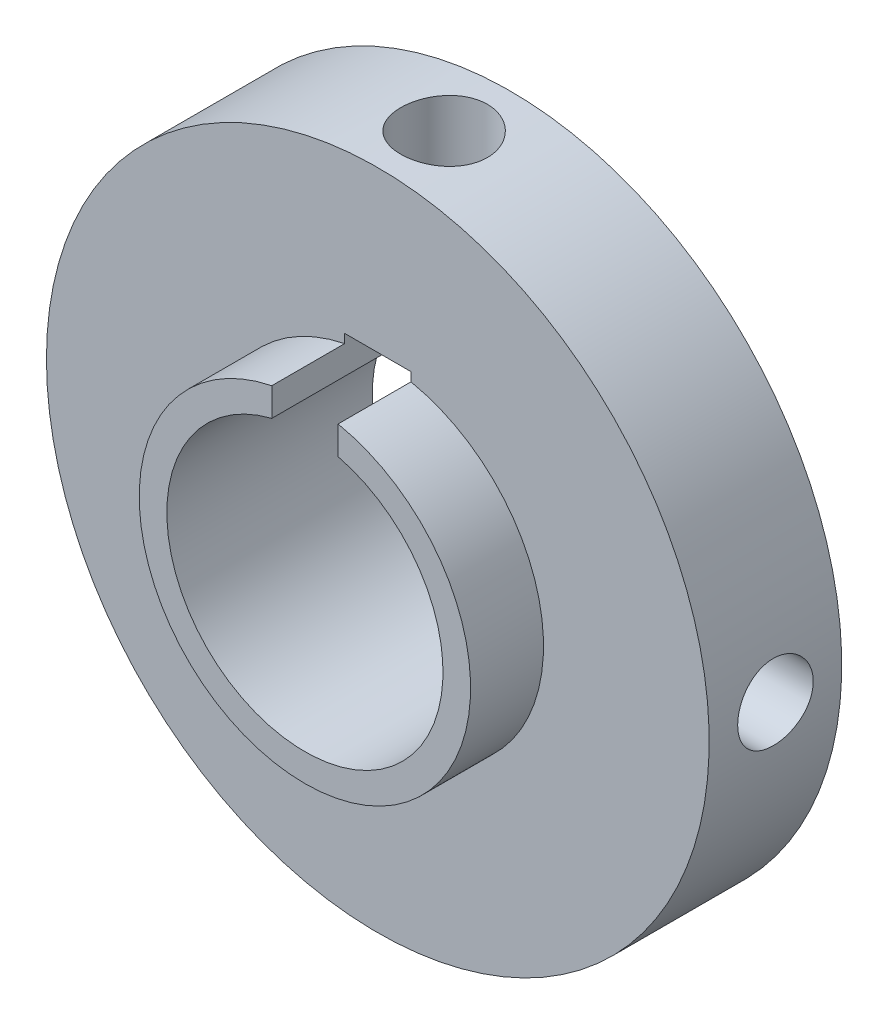
ISO-10303-21;
HEADER;
FILE_DESCRIPTION(('STEP AP214'),'2;1');
FILE_NAME('part.step','',(''),(''),'','','');
FILE_SCHEMA(('AUTOMOTIVE_DESIGN { 1 0 10303 214 1 1 1 1 }'));
ENDSEC;
DATA;
#1=APPLICATION_CONTEXT('core data for automotive mechanical design processes');
#2=APPLICATION_PROTOCOL_DEFINITION('international standard','automotive_design',2000,#1);
#3=PRODUCT_CONTEXT('',#1,'mechanical');
#4=PRODUCT('Part','Part','',(#3));
#5=PRODUCT_RELATED_PRODUCT_CATEGORY('part','',(#4));
#6=PRODUCT_DEFINITION_FORMATION('','',#4);
#7=PRODUCT_DEFINITION_CONTEXT('part definition',#1,'design');
#8=PRODUCT_DEFINITION('design','',#6,#7);
#9=PRODUCT_DEFINITION_SHAPE('','',#8);
#10=(LENGTH_UNIT() NAMED_UNIT(*) SI_UNIT(.MILLI.,.METRE.));
#11=(NAMED_UNIT(*) PLANE_ANGLE_UNIT() SI_UNIT($,.RADIAN.));
#12=(NAMED_UNIT(*) SI_UNIT($,.STERADIAN.) SOLID_ANGLE_UNIT());
#13=UNCERTAINTY_MEASURE_WITH_UNIT(LENGTH_MEASURE(1.E-05),#10,'distance_accuracy_value','');
#14=(GEOMETRIC_REPRESENTATION_CONTEXT(3) GLOBAL_UNCERTAINTY_ASSIGNED_CONTEXT((#13)) GLOBAL_UNIT_ASSIGNED_CONTEXT((#10,
#11,#12)) REPRESENTATION_CONTEXT('',''));
#15=CARTESIAN_POINT('',(0.,0.,0.));
#16=DIRECTION('',(0.,0.,1.));
#17=DIRECTION('',(1.,0.,0.));
#18=AXIS2_PLACEMENT_3D('',#15,#16,#17);
#19=CARTESIAN_POINT('',(0.,0.,-72.8201265681947));
#20=DIRECTION('',(0.,0.,-1.));
#21=DIRECTION('',(-1.,0.,0.));
#22=AXIS2_PLACEMENT_3D('',#19,#20,#21);
#23=CYLINDRICAL_SURFACE('',#22,19.05);
#24=CARTESIAN_POINT('',(0.,19.05,-10.4902));
#25=CARTESIAN_POINT('',(0.139183327600654,19.0499979875339,-10.4901941203857));
#26=CARTESIAN_POINT('',(0.278452322159493,19.0484585622037,-10.4784869997011));
#27=CARTESIAN_POINT('',(0.55311125898941,19.0424655814464,-10.4319718858473));
#28=CARTESIAN_POINT('',(0.688497058739124,19.0380090265548,-10.3971401148167));
#29=CARTESIAN_POINT('',(0.951373883626549,19.0266835808323,-10.3054226036942));
#30=CARTESIAN_POINT('',(1.07887029120805,19.0198163564801,-10.2485520960094));
#31=CARTESIAN_POINT('',(1.32248645490179,19.0044322984419,-10.1144056356154));
#32=CARTESIAN_POINT('',(1.43860807923912,18.9959157363339,-10.0371330415302));
#33=CARTESIAN_POINT('',(1.65689762059059,18.9781259897864,-9.86388113678995));
#34=CARTESIAN_POINT('',(1.75898751700133,18.9688489992307,-9.76780390448728));
#35=CARTESIAN_POINT('',(1.94564343818529,18.9506144662007,-9.55988039291599));
#36=CARTESIAN_POINT('',(2.03020854678139,18.9416569404479,-9.4480332897288));
#37=CARTESIAN_POINT('',(2.1797079486648,18.9250382326959,-9.21123408776088));
#38=CARTESIAN_POINT('',(2.24456861295855,18.9173819588514,-9.08623513031647));
#39=CARTESIAN_POINT('',(2.35234769632255,18.9042832671788,-8.82700190512351));
#40=CARTESIAN_POINT('',(2.39526702327966,18.8988407577517,-8.69276801975786));
#41=CARTESIAN_POINT('',(2.45770684986026,18.8908224386977,-8.41968764824884));
#42=CARTESIAN_POINT('',(2.47735951893281,18.8882304423774,-8.28087186630083));
#43=CARTESIAN_POINT('',(2.49311724083862,18.8861571876609,-8.00189020505851));
#44=CARTESIAN_POINT('',(2.4892233255809,18.8866757929452,-7.86172438519724));
#45=CARTESIAN_POINT('',(2.45810680402731,18.8907503328814,-7.58494518187634));
#46=CARTESIAN_POINT('',(2.43103012545022,18.8942872677045,-7.44831507312751));
#47=CARTESIAN_POINT('',(2.35454452632707,18.9039703016896,-7.18155453499112));
#48=CARTESIAN_POINT('',(2.30513511508237,18.9101164581817,-7.05142424848855));
#49=CARTESIAN_POINT('',(2.18523082985731,18.9243468471495,-6.80090591180025));
#50=CARTESIAN_POINT('',(2.11467288163238,18.9324368625476,-6.68054839241433));
#51=CARTESIAN_POINT('',(1.95451948096195,18.9496390247254,-6.45332677131935));
#52=CARTESIAN_POINT('',(1.86492307751163,18.9587512225544,-6.34646334408956));
#53=CARTESIAN_POINT('',(1.66842896972134,18.9770553922452,-6.14841661852966));
#54=CARTESIAN_POINT('',(1.56140554905709,18.9862474462609,-6.0573580121722));
#55=CARTESIAN_POINT('',(1.33352733515378,19.0036112479197,-5.89447777437709));
#56=CARTESIAN_POINT('',(1.21267250477496,19.0117829928228,-5.82265619459598));
#57=CARTESIAN_POINT('',(0.960463421921036,19.0261911939267,-5.70028734159824));
#58=CARTESIAN_POINT('',(0.829105150711743,19.0324269048804,-5.64974825809666));
#59=CARTESIAN_POINT('',(0.559666949866143,19.0422538167875,-5.57147998277334));
#60=CARTESIAN_POINT('',(0.42158736466693,19.0458451531014,-5.5437496234078));
#61=CARTESIAN_POINT('',(0.143703835449024,19.0499610063077,-5.51204845436486));
#62=CARTESIAN_POINT('',(0.00391979410829438,19.0505076846051,-5.50790594885224));
#63=CARTESIAN_POINT('',(-0.274349238590494,19.0485325646664,-5.52304441595078));
#64=CARTESIAN_POINT('',(-0.41283426016532,19.0460108379842,-5.54232484234789));
#65=CARTESIAN_POINT('',(-0.684064710858598,19.038196030461,-5.60361920163482));
#66=CARTESIAN_POINT('',(-0.816829039568173,19.032912977899,-5.64555089051313));
#67=CARTESIAN_POINT('',(-1.07344170969729,19.020166746343,-5.7508717239023));
#68=CARTESIAN_POINT('',(-1.19728972285362,19.0127034871335,-5.81426165793083));
#69=CARTESIAN_POINT('',(-1.43331849349072,18.996373074483,-5.96111231434907));
#70=CARTESIAN_POINT('',(-1.54542989381428,18.9874982794635,-6.04468364788542));
#71=CARTESIAN_POINT('',(-1.75409645063827,18.9693604671913,-6.22936886557429));
#72=CARTESIAN_POINT('',(-1.85065092968525,18.9600974330543,-6.33048351328323));
#73=CARTESIAN_POINT('',(-2.02607529885196,18.9421583616221,-6.54814314276526));
#74=CARTESIAN_POINT('',(-2.10483109767861,18.9334863471184,-6.66478045755355));
#75=CARTESIAN_POINT('',(-2.24163331200434,18.9177784554742,-6.90972830756669));
#76=CARTESIAN_POINT('',(-2.29968017468929,18.9107425430052,-7.03803859065201));
#77=CARTESIAN_POINT('',(-2.39323372009713,18.8991312878517,-7.30232790605961));
#78=CARTESIAN_POINT('',(-2.42880381986729,18.894549027944,-7.43828417295817));
#79=CARTESIAN_POINT('',(-2.47659789645958,18.8883443769084,-7.7143039353878));
#80=CARTESIAN_POINT('',(-2.48882306863554,18.8867218342312,-7.85436722025019));
#81=CARTESIAN_POINT('',(-2.48955695330535,18.8866250175378,-8.13348968109898));
#82=CARTESIAN_POINT('',(-2.47824493026679,18.8881269468366,-8.27254841136049));
#83=CARTESIAN_POINT('',(-2.4326061024809,18.8940585665465,-8.54676957704113));
#84=CARTESIAN_POINT('',(-2.39827930260557,18.8984882563378,-8.68193201328506));
#85=CARTESIAN_POINT('',(-2.30764297641232,18.9097687190586,-8.94449467517177));
#86=CARTESIAN_POINT('',(-2.25134291934427,18.9166184489654,-9.07189821716185));
#87=CARTESIAN_POINT('',(-2.11837584724466,18.9319688156645,-9.31547899849564));
#88=CARTESIAN_POINT('',(-2.04170848390134,18.9404694806897,-9.43165604580296));
#89=CARTESIAN_POINT('',(-1.86952076717625,18.9582413923205,-9.65040131309425));
#90=CARTESIAN_POINT('',(-1.77386694541854,18.9675178085154,-9.75286406043184));
#91=CARTESIAN_POINT('',(-1.56670135766749,18.9857508702412,-9.94035118287268));
#92=CARTESIAN_POINT('',(-1.45518587090404,18.9947074401251,-10.0253714549239));
#93=CARTESIAN_POINT('',(-1.21892803597153,19.0113330661053,-10.1758643995352));
#94=CARTESIAN_POINT('',(-1.09413272412976,19.0189966255648,-10.2412544971937));
#95=CARTESIAN_POINT('',(-0.835299282178844,19.032117580012,-10.350054684003));
#96=CARTESIAN_POINT('',(-0.701271274097131,19.0375773473887,-10.3934884220274));
#97=CARTESIAN_POINT('',(-0.472140331823302,19.0443740329528,-10.4468599615253));
#98=CARTESIAN_POINT('',(-0.37847635516118,19.0464733762006,-10.4630888109839));
#99=CARTESIAN_POINT('',(-0.189888205391961,19.0492870404998,-10.4847607910876));
#100=CARTESIAN_POINT('',(-0.0949640427949769,19.0500013730949,-10.4902040116295));
#101=CARTESIAN_POINT('',(0.,19.05,-10.4902));
#102=B_SPLINE_CURVE_WITH_KNOTS('',3,(#24,#25,#26,#27,#28,#29,#30,#31,#32,#33,#34,#35,#36,#37,
#38,#39,#40,#41,#42,#43,#44,#45,#46,#47,#48,#49,#50,#51,#52,#53,#54,#55,#56,#57,#58,#59,#60,#61,
#62,#63,#64,#65,#66,#67,#68,#69,#70,#71,#72,#73,#74,#75,#76,#77,#78,#79,#80,#81,#82,#83,#84,#85,
#86,#87,#88,#89,#90,#91,#92,#93,#94,#95,#96,#97,#98,#99,#100,#101),.UNSPECIFIED.,.T.,.F.,(4,2,2,
2,2,2,2,2,2,2,2,2,2,2,2,2,2,2,2,2,2,2,2,2,2,2,2,2,2,2,2,2,2,2,2,2,2,2,4),(0.,0.417203081435968,
0.834835816653142,1.25218041202275,1.66945634625339,2.08896593078243,2.50849744129355,
2.92957784822197,3.35064083030933,3.76930025056407,4.18794132355896,4.60396640391906,
5.02000062569849,5.43728820433135,5.85459663212553,6.27506093869544,6.69552637431254,
7.11615346166157,7.53675901641139,7.95429903339218,8.37182931368218,8.78785368261121,
9.20389336007525,9.62226721436388,10.0406592825552,10.4616616711285,10.8826549680849,
11.3024550869451,11.7222337097809,12.1388269120418,12.5554200261141,12.9718338096379,
13.3882547149264,13.8077137822507,14.2272714074873,14.6485699503921,15.0694137467576,
15.3540715587821,15.6387269982135),.UNSPECIFIED.);
#103=CARTESIAN_POINT('',(0.,19.05,-10.4902));
#104=VERTEX_POINT('',#103);
#105=EDGE_CURVE('E192',#104,#104,#102,.T.);
#106=ORIENTED_EDGE('',*,*,#105,.T.);
#107=EDGE_LOOP('',(#106));
#108=FACE_BOUND('',#107,.T.);
#109=CARTESIAN_POINT('',(0.,0.,-11.811));
#110=DIRECTION('',(0.,0.,-1.));
#111=DIRECTION('',(-1.,0.,0.));
#112=AXIS2_PLACEMENT_3D('',#109,#110,#111);
#113=CIRCLE('',#112,19.05);
#114=CARTESIAN_POINT('',(-19.05,0.,-11.811));
#115=VERTEX_POINT('',#114);
#116=EDGE_CURVE('E167',#115,#115,#113,.T.);
#117=ORIENTED_EDGE('',*,*,#116,.F.);
#118=EDGE_LOOP('',(#117));
#119=FACE_BOUND('',#118,.T.);
#120=CARTESIAN_POINT('',(0.,0.,-4.191));
#121=DIRECTION('',(0.,0.,-1.));
#122=DIRECTION('',(-1.,0.,0.));
#123=AXIS2_PLACEMENT_3D('',#120,#121,#122);
#124=CIRCLE('',#123,19.05);
#125=CARTESIAN_POINT('',(-19.05,0.,-4.191));
#126=VERTEX_POINT('',#125);
#127=EDGE_CURVE('E170',#126,#126,#124,.T.);
#128=ORIENTED_EDGE('',*,*,#127,.T.);
#129=EDGE_LOOP('',(#128));
#130=FACE_BOUND('',#129,.T.);
#131=CARTESIAN_POINT('',(19.05,0.,-5.8293));
#132=CARTESIAN_POINT('',(19.0499984300212,0.121562239712735,-5.82930521363775));
#133=CARTESIAN_POINT('',(19.0488241029087,0.243202504657999,-5.83954117300213));
#134=CARTESIAN_POINT('',(19.044252418921,0.483104034341952,-5.88021614111479));
#135=CARTESIAN_POINT('',(19.0408526810838,0.601361538277861,-5.91067678871353));
#136=CARTESIAN_POINT('',(19.0322135348144,0.830989299206532,-5.99089705643909));
#137=CARTESIAN_POINT('',(19.0269753057091,0.942363917590439,-6.04064430702978));
#138=CARTESIAN_POINT('',(19.0152432322378,1.15516050548646,-6.15799995704998));
#139=CARTESIAN_POINT('',(19.0087496192693,1.25658430398821,-6.22560506568685));
#140=CARTESIAN_POINT('',(18.9951993845639,1.44709104548634,-6.37709156348444));
#141=CARTESIAN_POINT('',(18.988140556053,1.53612148970276,-6.46103878324882));
#142=CARTESIAN_POINT('',(18.9742734662561,1.69886253117185,-6.64268553200976));
#143=CARTESIAN_POINT('',(18.9674652171852,1.77257238239387,-6.7403857303142));
#144=CARTESIAN_POINT('',(18.9548481176373,1.90277133744105,-6.94710088438818));
#145=CARTESIAN_POINT('',(18.9490420991919,1.95921197946082,-7.05614655140054));
#146=CARTESIAN_POINT('',(18.9391152671935,2.05296092288127,-7.28224527304023));
#147=CARTESIAN_POINT('',(18.9349944002113,2.09026983088086,-7.39929807365657));
#148=CARTESIAN_POINT('',(18.9289250942436,2.14453836587859,-7.63754733663827));
#149=CARTESIAN_POINT('',(18.9269672630179,2.16158599517607,-7.75872351043572));
#150=CARTESIAN_POINT('',(18.9254167980411,2.17512023476941,-8.00223160740553));
#151=CARTESIAN_POINT('',(18.925824084611,2.17160753772688,-8.12456349150428));
#152=CARTESIAN_POINT('',(18.9289492466911,2.14419320959937,-8.36630028605352));
#153=CARTESIAN_POINT('',(18.9316561818334,2.12038811590909,-8.48571630582951));
#154=CARTESIAN_POINT('',(18.9390585683123,2.05321516368547,-8.71884729938399));
#155=CARTESIAN_POINT('',(18.9437540537052,2.00984697010872,-8.83256217548595));
#156=CARTESIAN_POINT('',(18.954616979346,1.90467381677954,-9.05136520078914));
#157=CARTESIAN_POINT('',(18.9607877950157,1.84282649622392,-9.15643281380599));
#158=CARTESIAN_POINT('',(18.9739033762965,1.70248107127196,-9.35473394269845));
#159=CARTESIAN_POINT('',(18.9808481713614,1.62398233310685,-9.44796700792397));
#160=CARTESIAN_POINT('',(18.9947779124833,1.45202540115142,-9.62051313333237));
#161=CARTESIAN_POINT('',(19.0017628601769,1.35848392081477,-9.69974321489213));
#162=CARTESIAN_POINT('',(19.0149484336813,1.15938470280485,-9.84138961027748));
#163=CARTESIAN_POINT('',(19.0211490581624,1.0538269447607,-9.90380589559847));
#164=CARTESIAN_POINT('',(19.0320703058456,0.833630611886833,-10.010051404));
#165=CARTESIAN_POINT('',(19.0367905519363,0.718989732524944,-10.0538758920091));
#166=CARTESIAN_POINT('',(19.0442156094065,0.48391082138827,-10.1216302859544));
#167=CARTESIAN_POINT('',(19.0469204991888,0.363473015323217,-10.1455609658161));
#168=CARTESIAN_POINT('',(19.049999945832,0.120937031280761,-10.1727419575717));
#169=CARTESIAN_POINT('',(19.0503873932404,-0.00114816901587649,-10.1761066679643));
#170=CARTESIAN_POINT('',(19.0488229932879,-0.244143337360548,-10.1623614383308));
#171=CARTESIAN_POINT('',(19.0468711871997,-0.365053326105577,-10.1452518595443));
#172=CARTESIAN_POINT('',(19.0408557058953,-0.601931767483953,-10.0911387096559));
#173=CARTESIAN_POINT('',(19.0367977735068,-0.717912734464439,-10.0541892271024));
#174=CARTESIAN_POINT('',(19.0270247639441,-0.942031192661779,-9.96150105976082));
#175=CARTESIAN_POINT('',(19.0213096392683,-1.05016845893648,-9.9057618363781));
#176=CARTESIAN_POINT('',(19.008828218484,-1.25604377083453,-9.77679640745242));
#177=CARTESIAN_POINT('',(19.0020574856119,-1.35373484701352,-9.70349565829805));
#178=CARTESIAN_POINT('',(18.9882374226509,-1.53546794824197,-9.54159403641405));
#179=CARTESIAN_POINT('',(18.9811880834257,-1.61950952522137,-9.45299266160997));
#180=CARTESIAN_POINT('',(18.967565991023,-1.77195984462547,-9.26250312674735));
#181=CARTESIAN_POINT('',(18.9609956386449,-1.84029310120987,-9.16055435844487));
#182=CARTESIAN_POINT('',(18.9491136241086,-1.9588667667488,-8.94656033147575));
#183=CARTESIAN_POINT('',(18.9438019403781,-2.00910748579894,-8.83451524589531));
#184=CARTESIAN_POINT('',(18.9350544627907,-2.08994576393226,-8.60375982972553));
#185=CARTESIAN_POINT('',(18.9316145024316,-2.1205869789317,-8.48506495727939));
#186=CARTESIAN_POINT('',(18.9269875848234,-2.16149756343493,-8.24417333387456));
#187=CARTESIAN_POINT('',(18.9258005416961,-2.17176770945725,-8.12197671657793));
#188=CARTESIAN_POINT('',(18.925816054354,-2.17163200488484,-7.87830092116931));
#189=CARTESIAN_POINT('',(18.9270049056539,-2.16134473232867,-7.75682165893223));
#190=CARTESIAN_POINT('',(18.9316089055095,-2.12063615519308,-7.51732997849455));
#191=CARTESIAN_POINT('',(18.9350240554614,-2.09021483798792,-7.399317562468));
#192=CARTESIAN_POINT('',(18.9436918195646,-2.01013681338005,-7.17011833928553));
#193=CARTESIAN_POINT('',(18.9489439857769,-1.96048479488606,-7.05892987593524));
#194=CARTESIAN_POINT('',(18.9606948200793,-1.84336662593137,-6.84644475734944));
#195=CARTESIAN_POINT('',(18.9671934933187,-1.7759004018791,-6.74514814298012));
#196=CARTESIAN_POINT('',(18.9807500529853,-1.62462611671969,-6.55471503377013));
#197=CARTESIAN_POINT('',(18.987810837582,-1.54072960582295,-6.46564900358344));
#198=CARTESIAN_POINT('',(19.0016699910121,-1.35915769642174,-6.30281157432888));
#199=CARTESIAN_POINT('',(19.0084682971447,-1.26147903126308,-6.22904381153258));
#200=CARTESIAN_POINT('',(19.0210599231306,-1.05476434981729,-6.09870247586635));
#201=CARTESIAN_POINT('',(19.0268499675743,-0.945693094259462,-6.04218450857505));
#202=CARTESIAN_POINT('',(19.0367386134905,-0.719607014260444,-5.94834454398665));
#203=CARTESIAN_POINT('',(19.0408390843225,-0.602601136650229,-5.91100132025446));
#204=CARTESIAN_POINT('',(19.0458784526562,-0.404135377602736,-5.86568474492702));
#205=CARTESIAN_POINT('',(19.0474166548691,-0.323935481995639,-5.85205961871567));
#206=CARTESIAN_POINT('',(19.0494779504079,-0.162502011078207,-5.833865529601));
#207=CARTESIAN_POINT('',(19.0500010495836,-0.0812684417275751,-5.82929651450798));
#208=CARTESIAN_POINT('',(19.05,0.,-5.8293));
#209=B_SPLINE_CURVE_WITH_KNOTS('',3,(#131,#132,#133,#134,#135,#136,#137,#138,#139,#140,#141,
#142,#143,#144,#145,#146,#147,#148,#149,#150,#151,#152,#153,#154,#155,#156,#157,#158,#159,#160,
#161,#162,#163,#164,#165,#166,#167,#168,#169,#170,#171,#172,#173,#174,#175,#176,#177,#178,#179,
#180,#181,#182,#183,#184,#185,#186,#187,#188,#189,#190,#191,#192,#193,#194,#195,#196,#197,#198,
#199,#200,#201,#202,#203,#204,#205,#206,#207,#208),.UNSPECIFIED.,.T.,.F.,(4,2,2,2,2,2,2,2,2,2,2,
2,2,2,2,2,2,2,2,2,2,2,2,2,2,2,2,2,2,2,2,2,2,2,2,2,2,2,4),(0.,0.364389912167516,
0.729170322927145,1.0937171663807,1.45819687904042,1.82417639051717,2.19017371905853,
2.55718890356182,2.92419245060586,3.28959606999769,3.65498737929285,4.01865004511061,
4.38231893935911,4.74682797436952,5.11135088543046,5.47796630362241,5.84458234333731,
6.21129169907103,6.57798678810387,6.94264026036084,7.30728729892046,7.67094522859574,
8.03461358315679,8.39985384206373,8.76510608823555,9.13207846795665,9.49904455768439,
9.86519039472244,10.2313222744914,10.5953483507096,10.9593746552029,11.3233122571241,
11.6872513625172,12.0532063791967,12.4192482809107,12.7864579691124,13.1532602751461,
13.396868578797,13.6404754785471),.UNSPECIFIED.);
#210=CARTESIAN_POINT('',(19.05,0.,-5.8293));
#211=VERTEX_POINT('',#210);
#212=EDGE_CURVE('E239',#211,#211,#209,.T.);
#213=ORIENTED_EDGE('',*,*,#212,.T.);
#214=EDGE_LOOP('',(#213));
#215=FACE_BOUND('',#214,.T.);
#216=ADVANCED_FACE('F38',(#108,#119,#130,#215),#23,.T.);
#217=CARTESIAN_POINT('',(0.,0.,-72.8201265681947));
#218=DIRECTION('',(0.,0.,-1.));
#219=DIRECTION('',(-1.,0.,0.));
#220=AXIS2_PLACEMENT_3D('',#217,#218,#219);
#221=CYLINDRICAL_SURFACE('',#220,7.93750000000001);
#222=CARTESIAN_POINT('',(-1.905,7.70550979818987,-9.60321460485166));
#223=CARTESIAN_POINT('',(-1.94925234580114,7.69456907539775,-9.55059524877553));
#224=CARTESIAN_POINT('',(-1.99132159616241,7.68376449072561,-9.49615175507019));
#225=CARTESIAN_POINT('',(-2.07086297465018,7.66271007243049,-9.3838897796311));
#226=CARTESIAN_POINT('',(-2.10833432257478,7.65246033312172,-9.32607072756045));
#227=CARTESIAN_POINT('',(-2.21350847524945,7.62296581440011,-9.14794583989665));
#228=CARTESIAN_POINT('',(-2.27393957157611,7.60498392126557,-9.02301010300435));
#229=CARTESIAN_POINT('',(-2.3734254408288,7.57452936271028,-8.76405715441955));
#230=CARTESIAN_POINT('',(-2.41244377786011,7.56206609468288,-8.63002489677373));
#231=CARTESIAN_POINT('',(-2.46753829464952,7.54427032198404,-8.35698353415074));
#232=CARTESIAN_POINT('',(-2.48364170712006,7.53892935345599,-8.21798053836541));
#233=CARTESIAN_POINT('',(-2.49219586385705,7.53610516727196,-7.94379298793134));
#234=CARTESIAN_POINT('',(-2.48541133794104,7.53836788591409,-7.80863420960068));
#235=CARTESIAN_POINT('',(-2.45011371695281,7.54991291179892,-7.5414003049806));
#236=CARTESIAN_POINT('',(-2.42158548888858,7.55920010784169,-7.40932739237374));
#237=CARTESIAN_POINT('',(-2.34413262736908,7.58357229943699,-7.15308996044707));
#238=CARTESIAN_POINT('',(-2.29537240640227,7.59861048490532,-7.02887078921306));
#239=CARTESIAN_POINT('',(-2.17900096751418,7.63279155152985,-6.79036729784303));
#240=CARTESIAN_POINT('',(-2.11141720212727,7.65192844574942,-6.67606882524227));
#241=CARTESIAN_POINT('',(-2.01487655356764,7.67754059538086,-6.53892305281675));
#242=CARTESIAN_POINT('',(-1.99371941879582,7.68306538013042,-6.51020342500267));
#243=CARTESIAN_POINT('',(-1.95023582708801,7.69421793073659,-6.45375714256098));
#244=CARTESIAN_POINT('',(-1.927911245563,7.69984552251894,-6.42602900894788));
#245=CARTESIAN_POINT('',(-1.90500000000005,7.70550979818987,-6.39878539514829));
#246=B_SPLINE_CURVE_WITH_KNOTS('',3,(#222,#223,#224,#225,#226,#227,#228,#229,#230,#231,#232,
#233,#234,#235,#236,#237,#238,#239,#240,#241,#242,#243,#244,#245),.UNSPECIFIED.,.F.,.F.,(4,2,2,
2,2,2,2,2,2,2,2,4),(0.,0.208735596026037,0.417506562823788,0.835196973108389,1.25359593778062,
1.67149724940872,2.07557584174892,2.47993591826789,2.88107244990192,3.28162699414378,
3.38989694496324,3.4979980139062),.UNSPECIFIED.);
#247=CARTESIAN_POINT('',(-1.905,7.70550979818987,-9.60321460485167));
#248=VERTEX_POINT('',#247);
#249=CARTESIAN_POINT('',(-1.905,7.70550979818987,-6.39878539514833));
#250=VERTEX_POINT('',#249);
#251=EDGE_CURVE('E135',#248,#250,#246,.T.);
#252=ORIENTED_EDGE('',*,*,#251,.T.);
#253=DIRECTION('',(0.,0.,-1.));
#254=VECTOR('',#253,1.);
#255=CARTESIAN_POINT('',(-1.905,7.70550979818987,23.8357719614868));
#256=LINE('',#255,#254);
#257=CARTESIAN_POINT('',(-1.905,7.70550979818987,0.));
#258=VERTEX_POINT('',#257);
#259=EDGE_CURVE('E206',#258,#250,#256,.T.);
#260=ORIENTED_EDGE('',*,*,#259,.F.);
#261=CARTESIAN_POINT('',(0.,0.,0.));
#262=DIRECTION('',(0.,0.,-1.));
#263=DIRECTION('',(-1.,0.,0.));
#264=AXIS2_PLACEMENT_3D('',#261,#262,#263);
#265=CIRCLE('',#264,7.93750000000001);
#266=CARTESIAN_POINT('',(1.905,7.70550979818987,0.));
#267=VERTEX_POINT('',#266);
#268=EDGE_CURVE('E162',#267,#258,#265,.T.);
#269=ORIENTED_EDGE('',*,*,#268,.F.);
#270=DIRECTION('',(0.,0.,-1.));
#271=VECTOR('',#270,1.);
#272=CARTESIAN_POINT('',(1.905,7.70550979818987,23.8357719614868));
#273=LINE('',#272,#271);
#274=CARTESIAN_POINT('',(1.905,7.70550979818987,-6.39878539514833));
#275=VERTEX_POINT('',#274);
#276=EDGE_CURVE('E142',#267,#275,#273,.T.);
#277=ORIENTED_EDGE('',*,*,#276,.T.);
#278=CARTESIAN_POINT('',(1.905,7.70550979818987,-6.39878539514832));
#279=CARTESIAN_POINT('',(1.94925234580113,7.69456907539775,-6.45140475122446));
#280=CARTESIAN_POINT('',(1.9913215961624,7.68376449072561,-6.5058482449298));
#281=CARTESIAN_POINT('',(2.07086297465017,7.66271007243049,-6.61811022036888));
#282=CARTESIAN_POINT('',(2.10833432257477,7.65246033312172,-6.67592927243953));
#283=CARTESIAN_POINT('',(2.21350847524944,7.62296581440012,-6.85405416010333));
#284=CARTESIAN_POINT('',(2.27393957157611,7.60498392126557,-6.97898989699564));
#285=CARTESIAN_POINT('',(2.3734254408288,7.57452936271029,-7.23794284558044));
#286=CARTESIAN_POINT('',(2.41244377786011,7.56206609468288,-7.37197510322626));
#287=CARTESIAN_POINT('',(2.46753829464952,7.54427032198404,-7.64501646584925));
#288=CARTESIAN_POINT('',(2.48364170712006,7.53892935345599,-7.78401946163458));
#289=CARTESIAN_POINT('',(2.49219586385705,7.53610516727196,-8.05820701206865));
#290=CARTESIAN_POINT('',(2.48541133794104,7.53836788591409,-8.19336579039931));
#291=CARTESIAN_POINT('',(2.45011371695282,7.54991291179892,-8.46059969501939));
#292=CARTESIAN_POINT('',(2.42158548888858,7.55920010784168,-8.59267260762624));
#293=CARTESIAN_POINT('',(2.34413262736908,7.58357229943699,-8.84891003955292));
#294=CARTESIAN_POINT('',(2.29537240640228,7.59861048490531,-8.97312921078693));
#295=CARTESIAN_POINT('',(2.17900096751418,7.63279155152984,-9.21163270215695));
#296=CARTESIAN_POINT('',(2.11141720212727,7.65192844574942,-9.32593117475772));
#297=CARTESIAN_POINT('',(2.01487655356764,7.67754059538086,-9.46307694718324));
#298=CARTESIAN_POINT('',(1.99371941879582,7.68306538013042,-9.49179657499732));
#299=CARTESIAN_POINT('',(1.95023582708802,7.69421793073659,-9.54824285743901));
#300=CARTESIAN_POINT('',(1.92791124556301,7.69984552251894,-9.57597099105211));
#301=CARTESIAN_POINT('',(1.90500000000005,7.70550979818987,-9.6032146048517));
#302=B_SPLINE_CURVE_WITH_KNOTS('',3,(#278,#279,#280,#281,#282,#283,#284,#285,#286,#287,#288,
#289,#290,#291,#292,#293,#294,#295,#296,#297,#298,#299,#300,#301),.UNSPECIFIED.,.F.,.F.,(4,2,2,
2,2,2,2,2,2,2,2,4),(0.,0.208735596026035,0.417506562823787,0.83519697310839,1.25359593778063,
1.67149724940873,2.07557584174892,2.47993591826789,2.88107244990192,3.28162699414378,
3.38989694496325,3.4979980139062),.UNSPECIFIED.);
#303=CARTESIAN_POINT('',(1.905,7.70550979818987,-9.60321460485167));
#304=VERTEX_POINT('',#303);
#305=EDGE_CURVE('E121',#275,#304,#302,.T.);
#306=ORIENTED_EDGE('',*,*,#305,.T.);
#307=CARTESIAN_POINT('',(1.905,7.70550979818987,-11.811));
#308=VERTEX_POINT('',#307);
#309=EDGE_CURVE('E61',#304,#308,#273,.T.);
#310=ORIENTED_EDGE('',*,*,#309,.T.);
#311=CARTESIAN_POINT('',(0.,0.,-11.811));
#312=DIRECTION('',(0.,0.,-1.));
#313=DIRECTION('',(-1.,0.,0.));
#314=AXIS2_PLACEMENT_3D('',#311,#312,#313);
#315=CIRCLE('',#314,7.93750000000001);
#316=CARTESIAN_POINT('',(-1.905,7.70550979818987,-11.811));
#317=VERTEX_POINT('',#316);
#318=EDGE_CURVE('E165',#308,#317,#315,.T.);
#319=ORIENTED_EDGE('',*,*,#318,.T.);
#320=EDGE_CURVE('E207',#248,#317,#256,.T.);
#321=ORIENTED_EDGE('',*,*,#320,.F.);
#322=EDGE_LOOP('',(#252,#260,#269,#277,#306,#310,#319,#321));
#323=FACE_BOUND('',#322,.T.);
#324=CARTESIAN_POINT('',(7.93750000000001,0.,-5.8293));
#325=CARTESIAN_POINT('',(7.93749831851204,-0.119603795521933,-5.82930259176928));
#326=CARTESIAN_POINT('',(7.93477022422062,-0.239234921145315,-5.83921361883337));
#327=CARTESIAN_POINT('',(7.92415254875469,-0.475043387277823,-5.87852097521988));
#328=CARTESIAN_POINT('',(7.91626067383208,-0.59121916893843,-5.90792596382439));
#329=CARTESIAN_POINT('',(7.89618524495984,-0.816679642810435,-5.98518799276074));
#330=CARTESIAN_POINT('',(7.88400738811305,-0.925973256828072,-6.03302054636555));
#331=CARTESIAN_POINT('',(7.85664270097296,-1.13498762981107,-6.14568718325549));
#332=CARTESIAN_POINT('',(7.84145562863758,-1.23470761777669,-6.21052263428087));
#333=CARTESIAN_POINT('',(7.80929562709812,-1.42416712842994,-6.35701739090809));
#334=CARTESIAN_POINT('',(7.79229092298422,-1.51364091076829,-6.43901340102222));
#335=CARTESIAN_POINT('',(7.75861325165152,-1.67775445139289,-6.61678239642786));
#336=CARTESIAN_POINT('',(7.74194032984308,-1.75239219149645,-6.71255725303872));
#337=CARTESIAN_POINT('',(7.71048682486815,-1.88603083496478,-6.91731160959268));
#338=CARTESIAN_POINT('',(7.69574621676645,-1.94472233851359,-7.02649975531819));
#339=CARTESIAN_POINT('',(7.67029507792098,-2.04280821908668,-7.25366296572583));
#340=CARTESIAN_POINT('',(7.65958376044822,-2.08220636364106,-7.37163630968164));
#341=CARTESIAN_POINT('',(7.64373265294387,-2.13965718698621,-7.61006942113879));
#342=CARTESIAN_POINT('',(7.6384669073289,-2.15819334229596,-7.7304041126666));
#343=CARTESIAN_POINT('',(7.63372713993725,-2.17490185399175,-7.97258153602546));
#344=CARTESIAN_POINT('',(7.63425197391599,-2.1730782335602,-8.09442396516771));
#345=CARTESIAN_POINT('',(7.64092154993747,-2.1495019704323,-8.33235405126683));
#346=CARTESIAN_POINT('',(7.64690018466961,-2.12833833614375,-8.4485054752497));
#347=CARTESIAN_POINT('',(7.66353720494759,-2.06762781808307,-8.67554247077225));
#348=CARTESIAN_POINT('',(7.67419598202598,-2.02807939625543,-8.78642760088272));
#349=CARTESIAN_POINT('',(7.69913564019875,-1.93125133723851,-9.00130072991491));
#350=CARTESIAN_POINT('',(7.7134577083419,-1.87376832554228,-9.10519209958435));
#351=CARTESIAN_POINT('',(7.74408854444722,-1.74284457075559,-9.30205938847437));
#352=CARTESIAN_POINT('',(7.7603977216498,-1.66940053808166,-9.39503305145035));
#353=CARTESIAN_POINT('',(7.79385306462537,-1.50564504033747,-9.57078634840443));
#354=CARTESIAN_POINT('',(7.81100871878774,-1.41484006458944,-9.65310503122305));
#355=CARTESIAN_POINT('',(7.84372187687469,-1.22050336233608,-9.80144309764872));
#356=CARTESIAN_POINT('',(7.85927931105422,-1.11697108085405,-9.86746177011271));
#357=CARTESIAN_POINT('',(7.88714733440739,-0.899380331636492,-9.98154366770032));
#358=CARTESIAN_POINT('',(7.8994420833029,-0.785274012880986,-10.029519749515));
#359=CARTESIAN_POINT('',(7.91928512508844,-0.550201377814807,-10.1054729972346));
#360=CARTESIAN_POINT('',(7.92683451162604,-0.429236649149939,-10.1334547713634));
#361=CARTESIAN_POINT('',(7.93616930159549,-0.187811715390835,-10.1678927146042));
#362=CARTESIAN_POINT('',(7.93812235512768,-0.0674471928415964,-10.1749751672525));
#363=CARTESIAN_POINT('',(7.93652838384375,0.17275111781104,-10.1691481202742));
#364=CARTESIAN_POINT('',(7.93298195984182,0.292584962456332,-10.1562408045165));
#365=CARTESIAN_POINT('',(7.92089613080062,0.526059402379601,-10.1113130341207));
#366=CARTESIAN_POINT('',(7.91244890325102,0.639773067618669,-10.0796452130295));
#367=CARTESIAN_POINT('',(7.8915228986772,0.860260361459358,-9.99850778614063));
#368=CARTESIAN_POINT('',(7.87904367349771,0.967033217006734,-9.94903620139052));
#369=CARTESIAN_POINT('',(7.85104911535446,1.17301600254065,-9.83255618739763));
#370=CARTESIAN_POINT('',(7.83547717525591,1.27202785578217,-9.76521143041261));
#371=CARTESIAN_POINT('',(7.80309543365071,1.45756401188833,-9.61531662161111));
#372=CARTESIAN_POINT('',(7.78628537477091,1.54408570724223,-9.53276340296073));
#373=CARTESIAN_POINT('',(7.75269961919614,1.70484902657743,-9.35186717766461));
#374=CARTESIAN_POINT('',(7.73593987552263,1.7786478524805,-9.25312693515943));
#375=CARTESIAN_POINT('',(7.70489934540296,1.90864236641801,-9.04430644480503));
#376=CARTESIAN_POINT('',(7.69061846048143,1.96483875379987,-8.93422664770893));
#377=CARTESIAN_POINT('',(7.66631840530735,2.05761261335475,-8.70637309223719));
#378=CARTESIAN_POINT('',(7.65627520803182,2.09430101002187,-8.58864720124389));
#379=CARTESIAN_POINT('',(7.64159275578099,2.14726246984599,-8.34837301836221));
#380=CARTESIAN_POINT('',(7.63695203020749,2.16354108880888,-8.22582604820629));
#381=CARTESIAN_POINT('',(7.63372733611658,2.17488915906789,-7.98393434100151));
#382=CARTESIAN_POINT('',(7.63493958367765,2.17067217450467,-7.86462530891581));
#383=CARTESIAN_POINT('',(7.64280455703624,2.14281354251682,-7.6284891154151));
#384=CARTESIAN_POINT('',(7.64945712856063,2.11917244590836,-7.51166188371919));
#385=CARTESIAN_POINT('',(7.66732866560341,2.05356026294743,-7.28475682763819));
#386=CARTESIAN_POINT('',(7.67850803583501,2.01174789161729,-7.17462976889658));
#387=CARTESIAN_POINT('',(7.7041726907688,1.91110294310316,-6.96286898670274));
#388=CARTESIAN_POINT('',(7.71865851849341,1.85226756979137,-6.86123666209796));
#389=CARTESIAN_POINT('',(7.74986207909533,1.71711600979047,-6.66596285859824));
#390=CARTESIAN_POINT('',(7.76663488297831,1.64031650162841,-6.572664657382));
#391=CARTESIAN_POINT('',(7.80022354277445,1.47232606477994,-6.40004832824964));
#392=CARTESIAN_POINT('',(7.81703940826393,1.38113160022733,-6.32073364529681));
#393=CARTESIAN_POINT('',(7.8492798394259,1.18442305732331,-6.17654662650589));
#394=CARTESIAN_POINT('',(7.86466377285816,1.0786291034262,-6.11204622132489));
#395=CARTESIAN_POINT('',(7.89185484979556,0.857280488493993,-6.0018465743064));
#396=CARTESIAN_POINT('',(7.90366416753996,0.741731815635566,-5.95613589764315));
#397=CARTESIAN_POINT('',(7.92094506324948,0.522265123730455,-5.89041153230038));
#398=CARTESIAN_POINT('',(7.92710675920575,0.419245670834393,-5.86754961559039));
#399=CARTESIAN_POINT('',(7.93538474533973,0.210824380234361,-5.83699354444672));
#400=CARTESIAN_POINT('',(7.93750148212003,0.105422806839887,-5.82929771552741));
#401=CARTESIAN_POINT('',(7.93750000000001,0.,-5.8293));
#402=B_SPLINE_CURVE_WITH_KNOTS('',3,(#324,#325,#326,#327,#328,#329,#330,#331,#332,#333,#334,
#335,#336,#337,#338,#339,#340,#341,#342,#343,#344,#345,#346,#347,#348,#349,#350,#351,#352,#353,
#354,#355,#356,#357,#358,#359,#360,#361,#362,#363,#364,#365,#366,#367,#368,#369,#370,#371,#372,
#373,#374,#375,#376,#377,#378,#379,#380,#381,#382,#383,#384,#385,#386,#387,#388,#389,#390,#391,
#392,#393,#394,#395,#396,#397,#398,#399,#400,#401),.UNSPECIFIED.,.T.,.F.,(4,2,2,2,2,2,2,2,2,2,2,
2,2,2,2,2,2,2,2,2,2,2,2,2,2,2,2,2,2,2,2,2,2,2,2,2,2,2,4),(0.,0.358424650845324,
0.717008621879672,1.07511773747444,1.43325566877953,1.79922037796781,2.16523483620197,
2.5379124802067,2.91051732016036,3.27429680974951,3.63800441616327,3.99099144754578,
4.34400801483565,4.70118288322277,5.05843143566319,5.42797483413497,5.79753435233927,
6.16885654434868,6.54009312758398,6.90008596949217,7.2600394851978,7.61343267497685,
7.96686515781931,8.32748863140103,8.6881872820883,9.05963510888194,9.43106817612716,
9.80036601763237,10.1695633096397,10.526000805281,10.8824281936516,11.2358030788426,
11.5892360409127,11.9535732603363,12.3180001124106,12.6907644249735,13.0633015480813,
13.3792639740558,13.6951915127081),.UNSPECIFIED.);
#403=CARTESIAN_POINT('',(7.93750000000001,0.,-5.8293));
#404=VERTEX_POINT('',#403);
#405=EDGE_CURVE('E245',#404,#404,#402,.T.);
#406=ORIENTED_EDGE('',*,*,#405,.T.);
#407=EDGE_LOOP('',(#406));
#408=FACE_BOUND('',#407,.T.);
#409=ADVANCED_FACE('F213',(#323,#408),#221,.F.);
#410=CARTESIAN_POINT('',(1.905,9.8425,23.8357719614868));
#411=DIRECTION('',(0.,1.,0.));
#412=DIRECTION('',(0.,0.,1.));
#413=AXIS2_PLACEMENT_3D('',#410,#411,#412);
#414=PLANE('',#413);
#415=CARTESIAN_POINT('',(0.,9.8425,-8.001));
#416=DIRECTION('',(0.,1.,0.));
#417=DIRECTION('',(0.,0.,1.));
#418=AXIS2_PLACEMENT_3D('',#415,#416,#417);
#419=CIRCLE('',#418,2.4892);
#420=CARTESIAN_POINT('',(1.905,9.8425,-9.60321460485167));
#421=VERTEX_POINT('',#420);
#422=CARTESIAN_POINT('',(-1.905,9.8425,-9.60321460485167));
#423=VERTEX_POINT('',#422);
#424=EDGE_CURVE('E53',#421,#423,#419,.T.);
#425=ORIENTED_EDGE('',*,*,#424,.T.);
#426=DIRECTION('',(0.,0.,-1.));
#427=VECTOR('',#426,1.);
#428=CARTESIAN_POINT('',(-1.905,9.8425,23.8357719614868));
#429=LINE('',#428,#427);
#430=CARTESIAN_POINT('',(-1.905,9.8425,-11.811));
#431=VERTEX_POINT('',#430);
#432=EDGE_CURVE('E188',#423,#431,#429,.T.);
#433=ORIENTED_EDGE('',*,*,#432,.T.);
#434=DIRECTION('',(1.,0.,0.));
#435=VECTOR('',#434,1.);
#436=CARTESIAN_POINT('',(1.905,9.8425,-11.811));
#437=LINE('',#436,#435);
#438=CARTESIAN_POINT('',(1.905,9.8425,-11.811));
#439=VERTEX_POINT('',#438);
#440=EDGE_CURVE('E199',#431,#439,#437,.T.);
#441=ORIENTED_EDGE('',*,*,#440,.T.);
#442=DIRECTION('',(0.,0.,-1.));
#443=VECTOR('',#442,1.);
#444=CARTESIAN_POINT('',(1.905,9.8425,23.8357719614868));
#445=LINE('',#444,#443);
#446=EDGE_CURVE('E140',#421,#439,#445,.T.);
#447=ORIENTED_EDGE('',*,*,#446,.F.);
#448=EDGE_LOOP('',(#425,#433,#441,#447));
#449=FACE_BOUND('',#448,.T.);
#450=ADVANCED_FACE('F265',(#449),#414,.F.);
#451=CARTESIAN_POINT('',(-1.905,9.8425,-6.39878539514833));
#452=VERTEX_POINT('',#451);
#453=CARTESIAN_POINT('',(1.905,9.8425,-6.39878539514833));
#454=VERTEX_POINT('',#453);
#455=EDGE_CURVE('E119',#452,#454,#419,.T.);
#456=ORIENTED_EDGE('',*,*,#455,.T.);
#457=CARTESIAN_POINT('',(1.905,9.8425,-4.191));
#458=VERTEX_POINT('',#457);
#459=EDGE_CURVE('E131',#458,#454,#445,.T.);
#460=ORIENTED_EDGE('',*,*,#459,.F.);
#461=DIRECTION('',(1.,0.,0.));
#462=VECTOR('',#461,1.);
#463=CARTESIAN_POINT('',(9.52500000000001,9.8425,-4.191));
#464=LINE('',#463,#462);
#465=CARTESIAN_POINT('',(-1.905,9.8425,-4.191));
#466=VERTEX_POINT('',#465);
#467=EDGE_CURVE('E160',#466,#458,#464,.T.);
#468=ORIENTED_EDGE('',*,*,#467,.F.);
#469=EDGE_CURVE('E134',#466,#452,#429,.T.);
#470=ORIENTED_EDGE('',*,*,#469,.T.);
#471=EDGE_LOOP('',(#456,#460,#468,#470));
#472=FACE_BOUND('',#471,.T.);
#473=ADVANCED_FACE('F130',(#472),#414,.F.);
#474=CARTESIAN_POINT('',(-1.905,9.8425,23.8357719614868));
#475=DIRECTION('',(-1.,0.,0.));
#476=DIRECTION('',(0.,0.,1.));
#477=AXIS2_PLACEMENT_3D('',#474,#475,#476);
#478=PLANE('',#477);
#479=DIRECTION('',(0.,-1.,0.));
#480=VECTOR('',#479,1.);
#481=CARTESIAN_POINT('',(-1.905,19.051,-9.60321460485167));
#482=LINE('',#481,#480);
#483=EDGE_CURVE('E125',#423,#248,#482,.T.);
#484=ORIENTED_EDGE('',*,*,#483,.T.);
#485=ORIENTED_EDGE('',*,*,#320,.T.);
#486=DIRECTION('',(0.,1.,0.));
#487=VECTOR('',#486,1.);
#488=CARTESIAN_POINT('',(-1.905,9.8425,-11.811));
#489=LINE('',#488,#487);
#490=EDGE_CURVE('E144',#317,#431,#489,.T.);
#491=ORIENTED_EDGE('',*,*,#490,.T.);
#492=ORIENTED_EDGE('',*,*,#432,.F.);
#493=EDGE_LOOP('',(#484,#485,#491,#492));
#494=FACE_BOUND('',#493,.T.);
#495=ADVANCED_FACE('F288',(#494),#478,.F.);
#496=DIRECTION('',(0.,-1.,0.));
#497=VECTOR('',#496,1.);
#498=CARTESIAN_POINT('',(-1.905,19.051,-6.39878539514833));
#499=LINE('',#498,#497);
#500=EDGE_CURVE('E203',#250,#452,#499,.F.);
#501=ORIENTED_EDGE('',*,*,#500,.T.);
#502=ORIENTED_EDGE('',*,*,#469,.F.);
#503=DIRECTION('',(0.,1.,0.));
#504=VECTOR('',#503,1.);
#505=CARTESIAN_POINT('',(-1.905,0.,-4.191));
#506=LINE('',#505,#504);
#507=CARTESIAN_POINT('',(-1.905,9.33255592000391,-4.191));
#508=VERTEX_POINT('',#507);
#509=EDGE_CURVE('E154',#508,#466,#506,.T.);
#510=ORIENTED_EDGE('',*,*,#509,.F.);
#511=DIRECTION('',(0.,0.,-1.));
#512=VECTOR('',#511,1.);
#513=CARTESIAN_POINT('',(-1.905,9.33255592000391,-72.8201265681947));
#514=LINE('',#513,#512);
#515=CARTESIAN_POINT('',(-1.905,9.33255592000391,0.));
#516=VERTEX_POINT('',#515);
#517=EDGE_CURVE('E157',#516,#508,#514,.T.);
#518=ORIENTED_EDGE('',*,*,#517,.F.);
#519=DIRECTION('',(0.,-1.,0.));
#520=VECTOR('',#519,1.);
#521=CARTESIAN_POINT('',(-1.905,9.8425,0.));
#522=LINE('',#521,#520);
#523=EDGE_CURVE('E149',#516,#258,#522,.T.);
#524=ORIENTED_EDGE('',*,*,#523,.T.);
#525=ORIENTED_EDGE('',*,*,#259,.T.);
#526=EDGE_LOOP('',(#501,#502,#510,#518,#524,#525));
#527=FACE_BOUND('',#526,.T.);
#528=ADVANCED_FACE('F181',(#527),#478,.F.);
#529=CARTESIAN_POINT('',(1.905,7.70550979818987,23.8357719614868));
#530=DIRECTION('',(1.,0.,0.));
#531=DIRECTION('',(0.,0.,-1.));
#532=AXIS2_PLACEMENT_3D('',#529,#530,#531);
#533=PLANE('',#532);
#534=DIRECTION('',(0.,-1.,0.));
#535=VECTOR('',#534,1.);
#536=CARTESIAN_POINT('',(1.905,19.051,-6.39878539514833));
#537=LINE('',#536,#535);
#538=EDGE_CURVE('E115',#454,#275,#537,.T.);
#539=ORIENTED_EDGE('',*,*,#538,.T.);
#540=ORIENTED_EDGE('',*,*,#276,.F.);
#541=DIRECTION('',(0.,1.,0.));
#542=VECTOR('',#541,1.);
#543=CARTESIAN_POINT('',(1.905,7.70550979818987,0.));
#544=LINE('',#543,#542);
#545=CARTESIAN_POINT('',(1.905,9.33255592000391,0.));
#546=VERTEX_POINT('',#545);
#547=EDGE_CURVE('E147',#267,#546,#544,.T.);
#548=ORIENTED_EDGE('',*,*,#547,.T.);
#549=DIRECTION('',(0.,0.,-1.));
#550=VECTOR('',#549,1.);
#551=CARTESIAN_POINT('',(1.905,9.33255592000391,-72.8201265681947));
#552=LINE('',#551,#550);
#553=CARTESIAN_POINT('',(1.905,9.33255592000391,-4.191));
#554=VERTEX_POINT('',#553);
#555=EDGE_CURVE('E151',#554,#546,#552,.F.);
#556=ORIENTED_EDGE('',*,*,#555,.F.);
#557=DIRECTION('',(0.,-1.,0.));
#558=VECTOR('',#557,1.);
#559=CARTESIAN_POINT('',(1.905,0.,-4.191));
#560=LINE('',#559,#558);
#561=EDGE_CURVE('E139',#458,#554,#560,.T.);
#562=ORIENTED_EDGE('',*,*,#561,.F.);
#563=ORIENTED_EDGE('',*,*,#459,.T.);
#564=EDGE_LOOP('',(#539,#540,#548,#556,#562,#563));
#565=FACE_BOUND('',#564,.T.);
#566=ADVANCED_FACE('F137',(#565),#533,.F.);
#567=DIRECTION('',(0.,-1.,0.));
#568=VECTOR('',#567,1.);
#569=CARTESIAN_POINT('',(1.905,19.051,-9.60321460485167));
#570=LINE('',#569,#568);
#571=EDGE_CURVE('E237',#304,#421,#570,.F.);
#572=ORIENTED_EDGE('',*,*,#571,.T.);
#573=ORIENTED_EDGE('',*,*,#446,.T.);
#574=DIRECTION('',(0.,-1.,0.));
#575=VECTOR('',#574,1.);
#576=CARTESIAN_POINT('',(1.905,7.70550979818987,-11.811));
#577=LINE('',#576,#575);
#578=EDGE_CURVE('E202',#439,#308,#577,.T.);
#579=ORIENTED_EDGE('',*,*,#578,.T.);
#580=ORIENTED_EDGE('',*,*,#309,.F.);
#581=EDGE_LOOP('',(#572,#573,#579,#580));
#582=FACE_BOUND('',#581,.T.);
#583=ADVANCED_FACE('F278',(#582),#533,.F.);
#584=CARTESIAN_POINT('',(7.93750000000001,0.,0.));
#585=DIRECTION('',(0.,0.,-1.));
#586=DIRECTION('',(-1.,0.,0.));
#587=AXIS2_PLACEMENT_3D('',#584,#585,#586);
#588=PLANE('',#587);
#589=ORIENTED_EDGE('',*,*,#268,.T.);
#590=ORIENTED_EDGE('',*,*,#523,.F.);
#591=CARTESIAN_POINT('',(0.,0.,0.));
#592=DIRECTION('',(0.,0.,-1.));
#593=DIRECTION('',(-1.,0.,0.));
#594=AXIS2_PLACEMENT_3D('',#591,#592,#593);
#595=CIRCLE('',#594,9.52500000000001);
#596=EDGE_CURVE('E11',#546,#516,#595,.T.);
#597=ORIENTED_EDGE('',*,*,#596,.F.);
#598=ORIENTED_EDGE('',*,*,#547,.F.);
#599=EDGE_LOOP('',(#589,#590,#597,#598));
#600=FACE_BOUND('',#599,.T.);
#601=ADVANCED_FACE('F40',(#600),#588,.F.);
#602=CARTESIAN_POINT('',(0.,0.,-72.8201265681947));
#603=DIRECTION('',(0.,0.,-1.));
#604=DIRECTION('',(-1.,0.,0.));
#605=AXIS2_PLACEMENT_3D('',#602,#603,#604);
#606=CYLINDRICAL_SURFACE('',#605,9.52500000000001);
#607=ORIENTED_EDGE('',*,*,#596,.T.);
#608=ORIENTED_EDGE('',*,*,#517,.T.);
#609=CARTESIAN_POINT('',(0.,0.,-4.191));
#610=DIRECTION('',(0.,0.,-1.));
#611=DIRECTION('',(-1.,0.,0.));
#612=AXIS2_PLACEMENT_3D('',#609,#610,#611);
#613=CIRCLE('',#612,9.52500000000001);
#614=EDGE_CURVE('E46',#554,#508,#613,.T.);
#615=ORIENTED_EDGE('',*,*,#614,.F.);
#616=ORIENTED_EDGE('',*,*,#555,.T.);
#617=EDGE_LOOP('',(#607,#608,#615,#616));
#618=FACE_BOUND('',#617,.T.);
#619=ADVANCED_FACE('F177',(#618),#606,.T.);
#620=CARTESIAN_POINT('',(9.52500000000001,0.,-4.191));
#621=DIRECTION('',(0.,0.,-1.));
#622=DIRECTION('',(-1.,0.,0.));
#623=AXIS2_PLACEMENT_3D('',#620,#621,#622);
#624=PLANE('',#623);
#625=ORIENTED_EDGE('',*,*,#127,.F.);
#626=EDGE_LOOP('',(#625));
#627=FACE_BOUND('',#626,.T.);
#628=ORIENTED_EDGE('',*,*,#614,.T.);
#629=ORIENTED_EDGE('',*,*,#509,.T.);
#630=ORIENTED_EDGE('',*,*,#467,.T.);
#631=ORIENTED_EDGE('',*,*,#561,.T.);
#632=EDGE_LOOP('',(#628,#629,#630,#631));
#633=FACE_BOUND('',#632,.T.);
#634=ADVANCED_FACE('F175',(#627,#633),#624,.F.);
#635=CARTESIAN_POINT('',(19.05,0.,-11.811));
#636=DIRECTION('',(0.,0.,1.));
#637=DIRECTION('',(1.,0.,0.));
#638=AXIS2_PLACEMENT_3D('',#635,#636,#637);
#639=PLANE('',#638);
#640=ORIENTED_EDGE('',*,*,#440,.F.);
#641=ORIENTED_EDGE('',*,*,#490,.F.);
#642=ORIENTED_EDGE('',*,*,#318,.F.);
#643=ORIENTED_EDGE('',*,*,#578,.F.);
#644=EDGE_LOOP('',(#640,#641,#642,#643));
#645=FACE_BOUND('',#644,.T.);
#646=ORIENTED_EDGE('',*,*,#116,.T.);
#647=EDGE_LOOP('',(#646));
#648=FACE_BOUND('',#647,.T.);
#649=ADVANCED_FACE('F271',(#645,#648),#639,.F.);
#650=CARTESIAN_POINT('',(0.,19.051,-8.001));
#651=DIRECTION('',(0.,-1.,0.));
#652=DIRECTION('',(0.,0.,-1.));
#653=AXIS2_PLACEMENT_3D('',#650,#651,#652);
#654=CYLINDRICAL_SURFACE('',#653,2.4892);
#655=ORIENTED_EDGE('',*,*,#251,.F.);
#656=ORIENTED_EDGE('',*,*,#483,.F.);
#657=ORIENTED_EDGE('',*,*,#424,.F.);
#658=ORIENTED_EDGE('',*,*,#571,.F.);
#659=ORIENTED_EDGE('',*,*,#305,.F.);
#660=ORIENTED_EDGE('',*,*,#538,.F.);
#661=ORIENTED_EDGE('',*,*,#455,.F.);
#662=ORIENTED_EDGE('',*,*,#500,.F.);
#663=EDGE_LOOP('',(#655,#656,#657,#658,#659,#660,#661,#662));
#664=FACE_BOUND('',#663,.T.);
#665=ORIENTED_EDGE('',*,*,#105,.F.);
#666=EDGE_LOOP('',(#665));
#667=FACE_BOUND('',#666,.T.);
#668=ADVANCED_FACE('F117',(#664,#667),#654,.F.);
#669=CARTESIAN_POINT('',(19.051,0.,-8.001));
#670=DIRECTION('',(-1.,0.,0.));
#671=DIRECTION('',(0.,0.,1.));
#672=AXIS2_PLACEMENT_3D('',#669,#670,#671);
#673=CYLINDRICAL_SURFACE('',#672,2.1717);
#674=ORIENTED_EDGE('',*,*,#405,.F.);
#675=EDGE_LOOP('',(#674));
#676=FACE_BOUND('',#675,.T.);
#677=ORIENTED_EDGE('',*,*,#212,.F.);
#678=EDGE_LOOP('',(#677));
#679=FACE_BOUND('',#678,.T.);
#680=ADVANCED_FACE('F226',(#676,#679),#673,.F.);
#681=CLOSED_SHELL('',(#216,#409,#450,#473,#495,#528,#566,#583,#601,#619,#634,#649,#668,#680));
#682=MANIFOLD_SOLID_BREP('B2',#681);
#683=ADVANCED_BREP_SHAPE_REPRESENTATION('',(#18,#682),#14);
#684=SHAPE_DEFINITION_REPRESENTATION(#9,#683);
ENDSEC;
END-ISO-10303-21;
